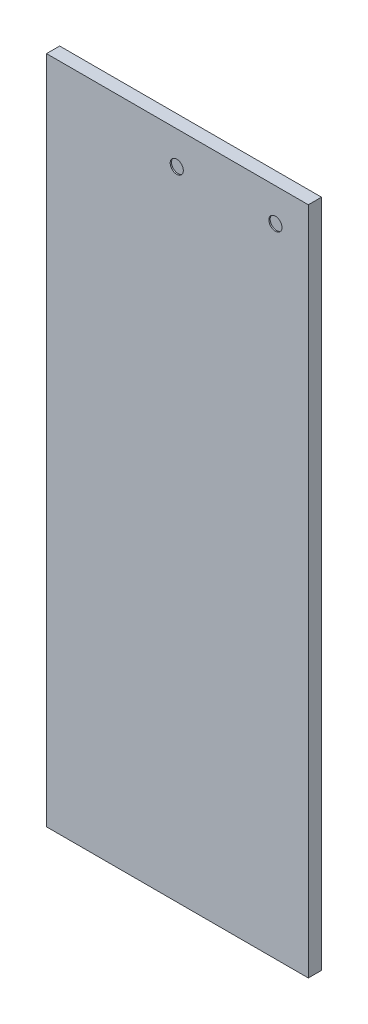
ISO-10303-21;
HEADER;
FILE_DESCRIPTION(('STEP AP214'),'2;1');
FILE_NAME('part.step','',(''),(''),'','','');
FILE_SCHEMA(('AUTOMOTIVE_DESIGN { 1 0 10303 214 1 1 1 1 }'));
ENDSEC;
DATA;
#1=APPLICATION_CONTEXT('core data for automotive mechanical design processes');
#2=APPLICATION_PROTOCOL_DEFINITION('international standard','automotive_design',2000,#1);
#3=PRODUCT_CONTEXT('',#1,'mechanical');
#4=PRODUCT('Part','Part','',(#3));
#5=PRODUCT_RELATED_PRODUCT_CATEGORY('part','',(#4));
#6=PRODUCT_DEFINITION_FORMATION('','',#4);
#7=PRODUCT_DEFINITION_CONTEXT('part definition',#1,'design');
#8=PRODUCT_DEFINITION('design','',#6,#7);
#9=PRODUCT_DEFINITION_SHAPE('','',#8);
#10=(LENGTH_UNIT() NAMED_UNIT(*) SI_UNIT(.MILLI.,.METRE.));
#11=(NAMED_UNIT(*) PLANE_ANGLE_UNIT() SI_UNIT($,.RADIAN.));
#12=(NAMED_UNIT(*) SI_UNIT($,.STERADIAN.) SOLID_ANGLE_UNIT());
#13=UNCERTAINTY_MEASURE_WITH_UNIT(LENGTH_MEASURE(1.E-05),#10,'distance_accuracy_value','');
#14=(GEOMETRIC_REPRESENTATION_CONTEXT(3) GLOBAL_UNCERTAINTY_ASSIGNED_CONTEXT((#13)) GLOBAL_UNIT_ASSIGNED_CONTEXT((#10,
#11,#12)) REPRESENTATION_CONTEXT('',''));
#15=CARTESIAN_POINT('',(0.,0.,0.));
#16=DIRECTION('',(0.,0.,1.));
#17=DIRECTION('',(1.,0.,0.));
#18=AXIS2_PLACEMENT_3D('',#15,#16,#17);
#19=CARTESIAN_POINT('',(-199.,-509.,20.));
#20=DIRECTION('',(1.,0.,0.));
#21=DIRECTION('',(0.,0.,-1.));
#22=AXIS2_PLACEMENT_3D('',#19,#20,#21);
#23=PLANE('',#22);
#24=DIRECTION('',(0.,-1.,0.));
#25=VECTOR('',#24,1.);
#26=CARTESIAN_POINT('',(-199.,-509.,0.));
#27=LINE('',#26,#25);
#28=CARTESIAN_POINT('',(-199.,509.,0.));
#29=VERTEX_POINT('',#28);
#30=CARTESIAN_POINT('',(-199.,-509.,0.));
#31=VERTEX_POINT('',#30);
#32=EDGE_CURVE('E96',#29,#31,#27,.T.);
#33=ORIENTED_EDGE('',*,*,#32,.T.);
#34=DIRECTION('',(0.,0.,-1.));
#35=VECTOR('',#34,1.);
#36=CARTESIAN_POINT('',(-199.,-509.,20.));
#37=LINE('',#36,#35);
#38=CARTESIAN_POINT('',(-199.,-509.,20.));
#39=VERTEX_POINT('',#38);
#40=EDGE_CURVE('E11',#39,#31,#37,.T.);
#41=ORIENTED_EDGE('',*,*,#40,.F.);
#42=DIRECTION('',(0.,-1.,0.));
#43=VECTOR('',#42,1.);
#44=CARTESIAN_POINT('',(-199.,-509.,20.));
#45=LINE('',#44,#43);
#46=CARTESIAN_POINT('',(-199.,509.,20.));
#47=VERTEX_POINT('',#46);
#48=EDGE_CURVE('E84',#47,#39,#45,.T.);
#49=ORIENTED_EDGE('',*,*,#48,.F.);
#50=DIRECTION('',(0.,0.,-1.));
#51=VECTOR('',#50,1.);
#52=CARTESIAN_POINT('',(-199.,509.,20.));
#53=LINE('',#52,#51);
#54=EDGE_CURVE('E92',#47,#29,#53,.T.);
#55=ORIENTED_EDGE('',*,*,#54,.T.);
#56=EDGE_LOOP('',(#33,#41,#49,#55));
#57=FACE_BOUND('',#56,.T.);
#58=ADVANCED_FACE('F33',(#57),#23,.F.);
#59=CARTESIAN_POINT('',(199.,-509.,20.));
#60=DIRECTION('',(0.,1.,0.));
#61=DIRECTION('',(0.,0.,1.));
#62=AXIS2_PLACEMENT_3D('',#59,#60,#61);
#63=PLANE('',#62);
#64=DIRECTION('',(1.,0.,0.));
#65=VECTOR('',#64,1.);
#66=CARTESIAN_POINT('',(199.,-509.,0.));
#67=LINE('',#66,#65);
#68=CARTESIAN_POINT('',(199.,-509.,0.));
#69=VERTEX_POINT('',#68);
#70=EDGE_CURVE('E88',#31,#69,#67,.T.);
#71=ORIENTED_EDGE('',*,*,#70,.T.);
#72=DIRECTION('',(0.,0.,-1.));
#73=VECTOR('',#72,1.);
#74=CARTESIAN_POINT('',(199.,-509.,20.));
#75=LINE('',#74,#73);
#76=CARTESIAN_POINT('',(199.,-509.,20.));
#77=VERTEX_POINT('',#76);
#78=EDGE_CURVE('E41',#77,#69,#75,.T.);
#79=ORIENTED_EDGE('',*,*,#78,.F.);
#80=DIRECTION('',(1.,0.,0.));
#81=VECTOR('',#80,1.);
#82=CARTESIAN_POINT('',(199.,-509.,20.));
#83=LINE('',#82,#81);
#84=EDGE_CURVE('E79',#39,#77,#83,.T.);
#85=ORIENTED_EDGE('',*,*,#84,.F.);
#86=ORIENTED_EDGE('',*,*,#40,.T.);
#87=EDGE_LOOP('',(#71,#79,#85,#86));
#88=FACE_BOUND('',#87,.T.);
#89=ADVANCED_FACE('F87',(#88),#63,.F.);
#90=CARTESIAN_POINT('',(199.,-509.,20.));
#91=DIRECTION('',(-1.,0.,0.));
#92=DIRECTION('',(0.,0.,1.));
#93=AXIS2_PLACEMENT_3D('',#90,#91,#92);
#94=PLANE('',#93);
#95=DIRECTION('',(0.,1.,0.));
#96=VECTOR('',#95,1.);
#97=CARTESIAN_POINT('',(199.,-509.,0.));
#98=LINE('',#97,#96);
#99=CARTESIAN_POINT('',(199.,509.,0.));
#100=VERTEX_POINT('',#99);
#101=EDGE_CURVE('E66',#69,#100,#98,.T.);
#102=ORIENTED_EDGE('',*,*,#101,.T.);
#103=DIRECTION('',(0.,0.,-1.));
#104=VECTOR('',#103,1.);
#105=CARTESIAN_POINT('',(199.,509.,20.));
#106=LINE('',#105,#104);
#107=CARTESIAN_POINT('',(199.,509.,20.));
#108=VERTEX_POINT('',#107);
#109=EDGE_CURVE('E89',#108,#100,#106,.T.);
#110=ORIENTED_EDGE('',*,*,#109,.F.);
#111=DIRECTION('',(0.,1.,0.));
#112=VECTOR('',#111,1.);
#113=CARTESIAN_POINT('',(199.,-509.,20.));
#114=LINE('',#113,#112);
#115=EDGE_CURVE('E82',#77,#108,#114,.T.);
#116=ORIENTED_EDGE('',*,*,#115,.F.);
#117=ORIENTED_EDGE('',*,*,#78,.T.);
#118=EDGE_LOOP('',(#102,#110,#116,#117));
#119=FACE_BOUND('',#118,.T.);
#120=ADVANCED_FACE('F90',(#119),#94,.F.);
#121=CARTESIAN_POINT('',(199.,509.,20.));
#122=DIRECTION('',(0.,-1.,0.));
#123=DIRECTION('',(0.,0.,-1.));
#124=AXIS2_PLACEMENT_3D('',#121,#122,#123);
#125=PLANE('',#124);
#126=DIRECTION('',(-1.,0.,0.));
#127=VECTOR('',#126,1.);
#128=CARTESIAN_POINT('',(199.,509.,0.));
#129=LINE('',#128,#127);
#130=EDGE_CURVE('E72',#100,#29,#129,.T.);
#131=ORIENTED_EDGE('',*,*,#130,.T.);
#132=ORIENTED_EDGE('',*,*,#54,.F.);
#133=DIRECTION('',(-1.,0.,0.));
#134=VECTOR('',#133,1.);
#135=CARTESIAN_POINT('',(199.,509.,20.));
#136=LINE('',#135,#134);
#137=EDGE_CURVE('E49',#108,#47,#136,.T.);
#138=ORIENTED_EDGE('',*,*,#137,.F.);
#139=ORIENTED_EDGE('',*,*,#109,.T.);
#140=EDGE_LOOP('',(#131,#132,#138,#139));
#141=FACE_BOUND('',#140,.T.);
#142=ADVANCED_FACE('F104',(#141),#125,.F.);
#143=CARTESIAN_POINT('',(0.,0.,20.));
#144=DIRECTION('',(0.,0.,1.));
#145=DIRECTION('',(1.,0.,0.));
#146=AXIS2_PLACEMENT_3D('',#143,#144,#145);
#147=PLANE('',#146);
#148=CARTESIAN_POINT('',(149.,459.,20.));
#149=DIRECTION('',(0.,0.,1.));
#150=DIRECTION('',(1.,0.,0.));
#151=AXIS2_PLACEMENT_3D('',#148,#149,#150);
#152=CIRCLE('',#151,10.);
#153=CARTESIAN_POINT('',(159.,459.,20.));
#154=VERTEX_POINT('',#153);
#155=EDGE_CURVE('E116',#154,#154,#152,.T.);
#156=ORIENTED_EDGE('',*,*,#155,.F.);
#157=EDGE_LOOP('',(#156));
#158=FACE_BOUND('',#157,.T.);
#159=CARTESIAN_POINT('',(-0.999999999999973,459.,20.));
#160=DIRECTION('',(0.,0.,1.));
#161=DIRECTION('',(1.,0.,0.));
#162=AXIS2_PLACEMENT_3D('',#159,#160,#161);
#163=CIRCLE('',#162,10.);
#164=CARTESIAN_POINT('',(9.00000000000003,459.,20.));
#165=VERTEX_POINT('',#164);
#166=EDGE_CURVE('E110',#165,#165,#163,.T.);
#167=ORIENTED_EDGE('',*,*,#166,.F.);
#168=EDGE_LOOP('',(#167));
#169=FACE_BOUND('',#168,.T.);
#170=ORIENTED_EDGE('',*,*,#48,.T.);
#171=ORIENTED_EDGE('',*,*,#84,.T.);
#172=ORIENTED_EDGE('',*,*,#115,.T.);
#173=ORIENTED_EDGE('',*,*,#137,.T.);
#174=EDGE_LOOP('',(#170,#171,#172,#173));
#175=FACE_BOUND('',#174,.T.);
#176=ADVANCED_FACE('F80',(#158,#169,#175),#147,.T.);
#177=CARTESIAN_POINT('',(0.,0.,0.));
#178=DIRECTION('',(0.,0.,1.));
#179=DIRECTION('',(1.,0.,0.));
#180=AXIS2_PLACEMENT_3D('',#177,#178,#179);
#181=PLANE('',#180);
#182=ORIENTED_EDGE('',*,*,#32,.F.);
#183=ORIENTED_EDGE('',*,*,#130,.F.);
#184=ORIENTED_EDGE('',*,*,#101,.F.);
#185=ORIENTED_EDGE('',*,*,#70,.F.);
#186=EDGE_LOOP('',(#182,#183,#184,#185));
#187=FACE_BOUND('',#186,.T.);
#188=ADVANCED_FACE('F107',(#187),#181,.F.);
#189=CARTESIAN_POINT('',(-0.999999999999973,459.,18.));
#190=DIRECTION('',(0.,0.,1.));
#191=DIRECTION('',(1.,0.,0.));
#192=AXIS2_PLACEMENT_3D('',#189,#190,#191);
#193=CYLINDRICAL_SURFACE('',#192,10.);
#194=CARTESIAN_POINT('',(-0.999999999999973,459.,18.));
#195=DIRECTION('',(0.,0.,1.));
#196=DIRECTION('',(1.,0.,0.));
#197=AXIS2_PLACEMENT_3D('',#194,#195,#196);
#198=CIRCLE('',#197,10.);
#199=CARTESIAN_POINT('',(9.00000000000003,459.,18.));
#200=VERTEX_POINT('',#199);
#201=EDGE_CURVE('E113',#200,#200,#198,.T.);
#202=ORIENTED_EDGE('',*,*,#201,.F.);
#203=EDGE_LOOP('',(#202));
#204=FACE_BOUND('',#203,.T.);
#205=ORIENTED_EDGE('',*,*,#166,.T.);
#206=EDGE_LOOP('',(#205));
#207=FACE_BOUND('',#206,.T.);
#208=ADVANCED_FACE('F136',(#204,#207),#193,.F.);
#209=CARTESIAN_POINT('',(-0.999999999999973,459.,18.));
#210=DIRECTION('',(0.,0.,1.));
#211=DIRECTION('',(1.,0.,0.));
#212=AXIS2_PLACEMENT_3D('',#209,#210,#211);
#213=PLANE('',#212);
#214=ORIENTED_EDGE('',*,*,#201,.T.);
#215=EDGE_LOOP('',(#214));
#216=FACE_BOUND('',#215,.T.);
#217=ADVANCED_FACE('F127',(#216),#213,.T.);
#218=CARTESIAN_POINT('',(149.,459.,18.));
#219=DIRECTION('',(0.,0.,1.));
#220=DIRECTION('',(1.,0.,0.));
#221=AXIS2_PLACEMENT_3D('',#218,#219,#220);
#222=CYLINDRICAL_SURFACE('',#221,10.);
#223=CARTESIAN_POINT('',(149.,459.,18.));
#224=DIRECTION('',(0.,0.,1.));
#225=DIRECTION('',(1.,0.,0.));
#226=AXIS2_PLACEMENT_3D('',#223,#224,#225);
#227=CIRCLE('',#226,10.);
#228=CARTESIAN_POINT('',(159.,459.,18.));
#229=VERTEX_POINT('',#228);
#230=EDGE_CURVE('E99',#229,#229,#227,.T.);
#231=ORIENTED_EDGE('',*,*,#230,.F.);
#232=EDGE_LOOP('',(#231));
#233=FACE_BOUND('',#232,.T.);
#234=ORIENTED_EDGE('',*,*,#155,.T.);
#235=EDGE_LOOP('',(#234));
#236=FACE_BOUND('',#235,.T.);
#237=ADVANCED_FACE('F124',(#233,#236),#222,.F.);
#238=CARTESIAN_POINT('',(149.,459.,18.));
#239=DIRECTION('',(0.,0.,1.));
#240=DIRECTION('',(1.,0.,0.));
#241=AXIS2_PLACEMENT_3D('',#238,#239,#240);
#242=PLANE('',#241);
#243=ORIENTED_EDGE('',*,*,#230,.T.);
#244=EDGE_LOOP('',(#243));
#245=FACE_BOUND('',#244,.T.);
#246=ADVANCED_FACE('F122',(#245),#242,.T.);
#247=CLOSED_SHELL('',(#58,#89,#120,#142,#176,#188,#208,#217,#237,#246));
#248=MANIFOLD_SOLID_BREP('B2',#247);
#249=ADVANCED_BREP_SHAPE_REPRESENTATION('',(#18,#248),#14);
#250=SHAPE_DEFINITION_REPRESENTATION(#9,#249);
ENDSEC;
END-ISO-10303-21;
